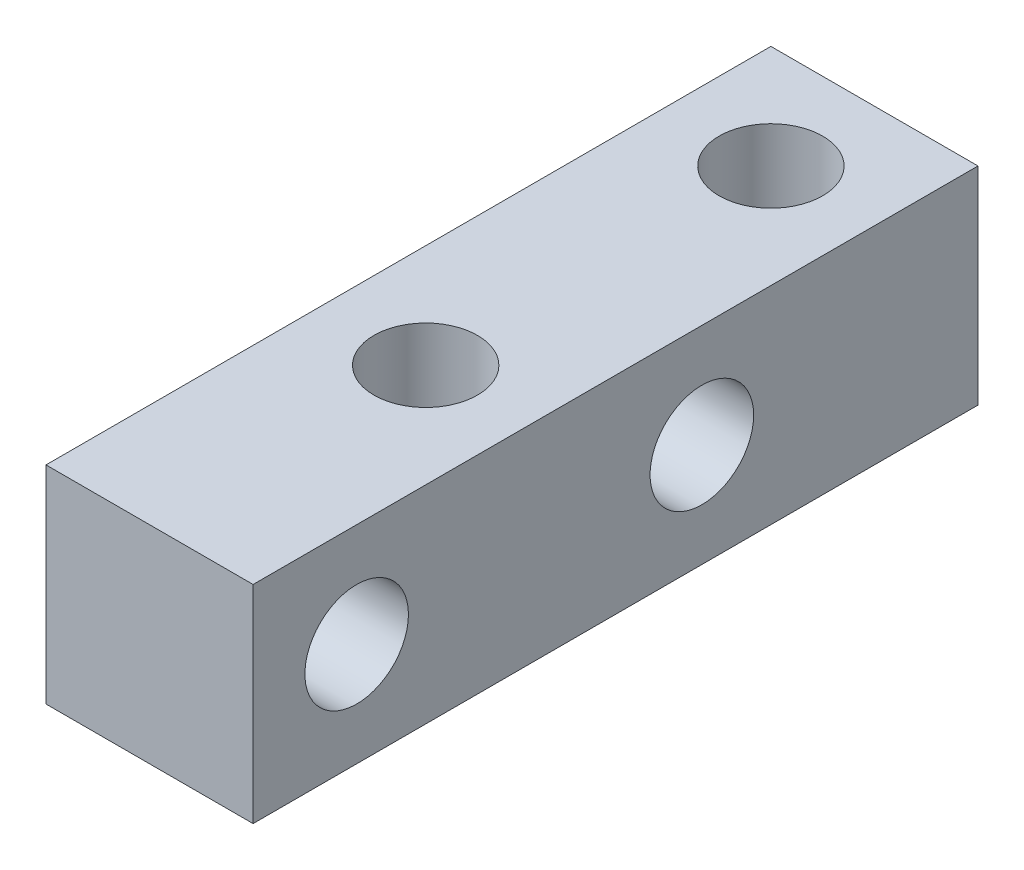
ISO-10303-21;
HEADER;
FILE_DESCRIPTION(('STEP AP214'),'2;1');
FILE_NAME('part.step','',(''),(''),'','','');
FILE_SCHEMA(('AUTOMOTIVE_DESIGN { 1 0 10303 214 1 1 1 1 }'));
ENDSEC;
DATA;
#1=APPLICATION_CONTEXT('core data for automotive mechanical design processes');
#2=APPLICATION_PROTOCOL_DEFINITION('international standard','automotive_design',2000,#1);
#3=PRODUCT_CONTEXT('',#1,'mechanical');
#4=PRODUCT('Part','Part','',(#3));
#5=PRODUCT_RELATED_PRODUCT_CATEGORY('part','',(#4));
#6=PRODUCT_DEFINITION_FORMATION('','',#4);
#7=PRODUCT_DEFINITION_CONTEXT('part definition',#1,'design');
#8=PRODUCT_DEFINITION('design','',#6,#7);
#9=PRODUCT_DEFINITION_SHAPE('','',#8);
#10=(LENGTH_UNIT() NAMED_UNIT(*) SI_UNIT(.MILLI.,.METRE.));
#11=(NAMED_UNIT(*) PLANE_ANGLE_UNIT() SI_UNIT($,.RADIAN.));
#12=(NAMED_UNIT(*) SI_UNIT($,.STERADIAN.) SOLID_ANGLE_UNIT());
#13=UNCERTAINTY_MEASURE_WITH_UNIT(LENGTH_MEASURE(1.E-05),#10,'distance_accuracy_value','');
#14=(GEOMETRIC_REPRESENTATION_CONTEXT(3) GLOBAL_UNCERTAINTY_ASSIGNED_CONTEXT((#13)) GLOBAL_UNIT_ASSIGNED_CONTEXT((#10,
#11,#12)) REPRESENTATION_CONTEXT('',''));
#15=CARTESIAN_POINT('',(0.,0.,0.));
#16=DIRECTION('',(0.,0.,1.));
#17=DIRECTION('',(1.,0.,0.));
#18=AXIS2_PLACEMENT_3D('',#15,#16,#17);
#19=CARTESIAN_POINT('',(3.,-3.,21.));
#20=DIRECTION('',(-1.,0.,0.));
#21=DIRECTION('',(0.,0.,1.));
#22=AXIS2_PLACEMENT_3D('',#19,#20,#21);
#23=PLANE('',#22);
#24=CARTESIAN_POINT('',(3.,0.,18.));
#25=DIRECTION('',(1.,0.,0.));
#26=DIRECTION('',(0.,0.,-1.));
#27=AXIS2_PLACEMENT_3D('',#24,#25,#26);
#28=CIRCLE('',#27,1.5);
#29=CARTESIAN_POINT('',(3.,0.,16.5));
#30=VERTEX_POINT('',#29);
#31=EDGE_CURVE('E158',#30,#30,#28,.T.);
#32=ORIENTED_EDGE('',*,*,#31,.F.);
#33=EDGE_LOOP('',(#32));
#34=FACE_BOUND('',#33,.T.);
#35=CARTESIAN_POINT('',(3.,0.,8.));
#36=DIRECTION('',(1.,0.,0.));
#37=DIRECTION('',(0.,0.,-1.));
#38=AXIS2_PLACEMENT_3D('',#35,#36,#37);
#39=CIRCLE('',#38,1.5);
#40=CARTESIAN_POINT('',(3.,0.,6.5));
#41=VERTEX_POINT('',#40);
#42=EDGE_CURVE('E152',#41,#41,#39,.T.);
#43=ORIENTED_EDGE('',*,*,#42,.F.);
#44=EDGE_LOOP('',(#43));
#45=FACE_BOUND('',#44,.T.);
#46=DIRECTION('',(0.,1.,0.));
#47=VECTOR('',#46,1.);
#48=CARTESIAN_POINT('',(3.,-3.,0.));
#49=LINE('',#48,#47);
#50=CARTESIAN_POINT('',(3.,-3.,0.));
#51=VERTEX_POINT('',#50);
#52=CARTESIAN_POINT('',(3.,3.,0.));
#53=VERTEX_POINT('',#52);
#54=EDGE_CURVE('E114',#51,#53,#49,.T.);
#55=ORIENTED_EDGE('',*,*,#54,.T.);
#56=DIRECTION('',(0.,0.,-1.));
#57=VECTOR('',#56,1.);
#58=CARTESIAN_POINT('',(3.,3.,21.));
#59=LINE('',#58,#57);
#60=CARTESIAN_POINT('',(3.,3.,21.));
#61=VERTEX_POINT('',#60);
#62=EDGE_CURVE('E11',#61,#53,#59,.T.);
#63=ORIENTED_EDGE('',*,*,#62,.F.);
#64=DIRECTION('',(0.,1.,0.));
#65=VECTOR('',#64,1.);
#66=CARTESIAN_POINT('',(3.,-3.,21.));
#67=LINE('',#66,#65);
#68=CARTESIAN_POINT('',(3.,-3.,21.));
#69=VERTEX_POINT('',#68);
#70=EDGE_CURVE('E100',#69,#61,#67,.T.);
#71=ORIENTED_EDGE('',*,*,#70,.F.);
#72=DIRECTION('',(0.,0.,-1.));
#73=VECTOR('',#72,1.);
#74=CARTESIAN_POINT('',(3.,-3.,21.));
#75=LINE('',#74,#73);
#76=EDGE_CURVE('E108',#69,#51,#75,.T.);
#77=ORIENTED_EDGE('',*,*,#76,.T.);
#78=EDGE_LOOP('',(#55,#63,#71,#77));
#79=FACE_BOUND('',#78,.T.);
#80=ADVANCED_FACE('F44',(#34,#45,#79),#23,.F.);
#81=CARTESIAN_POINT('',(-3.,3.,21.));
#82=DIRECTION('',(0.,-1.,0.));
#83=DIRECTION('',(0.,0.,-1.));
#84=AXIS2_PLACEMENT_3D('',#81,#82,#83);
#85=PLANE('',#84);
#86=CARTESIAN_POINT('',(0.,3.,3.));
#87=DIRECTION('',(0.,1.,0.));
#88=DIRECTION('',(0.,0.,1.));
#89=AXIS2_PLACEMENT_3D('',#86,#87,#88);
#90=CIRCLE('',#89,1.5);
#91=CARTESIAN_POINT('',(0.,3.,4.5));
#92=VERTEX_POINT('',#91);
#93=EDGE_CURVE('E141',#92,#92,#90,.T.);
#94=ORIENTED_EDGE('',*,*,#93,.F.);
#95=EDGE_LOOP('',(#94));
#96=FACE_BOUND('',#95,.T.);
#97=CARTESIAN_POINT('',(0.,3.,13.));
#98=DIRECTION('',(0.,1.,0.));
#99=DIRECTION('',(0.,0.,1.));
#100=AXIS2_PLACEMENT_3D('',#97,#98,#99);
#101=CIRCLE('',#100,1.5);
#102=CARTESIAN_POINT('',(0.,3.,14.5));
#103=VERTEX_POINT('',#102);
#104=EDGE_CURVE('E140',#103,#103,#101,.T.);
#105=ORIENTED_EDGE('',*,*,#104,.F.);
#106=EDGE_LOOP('',(#105));
#107=FACE_BOUND('',#106,.T.);
#108=DIRECTION('',(-1.,0.,0.));
#109=VECTOR('',#108,1.);
#110=CARTESIAN_POINT('',(-3.,3.,0.));
#111=LINE('',#110,#109);
#112=CARTESIAN_POINT('',(-3.,3.,0.));
#113=VERTEX_POINT('',#112);
#114=EDGE_CURVE('E105',#53,#113,#111,.T.);
#115=ORIENTED_EDGE('',*,*,#114,.T.);
#116=DIRECTION('',(0.,0.,-1.));
#117=VECTOR('',#116,1.);
#118=CARTESIAN_POINT('',(-3.,3.,21.));
#119=LINE('',#118,#117);
#120=CARTESIAN_POINT('',(-3.,3.,21.));
#121=VERTEX_POINT('',#120);
#122=EDGE_CURVE('E53',#121,#113,#119,.T.);
#123=ORIENTED_EDGE('',*,*,#122,.F.);
#124=DIRECTION('',(-1.,0.,0.));
#125=VECTOR('',#124,1.);
#126=CARTESIAN_POINT('',(-3.,3.,21.));
#127=LINE('',#126,#125);
#128=EDGE_CURVE('E95',#61,#121,#127,.T.);
#129=ORIENTED_EDGE('',*,*,#128,.F.);
#130=ORIENTED_EDGE('',*,*,#62,.T.);
#131=EDGE_LOOP('',(#115,#123,#129,#130));
#132=FACE_BOUND('',#131,.T.);
#133=ADVANCED_FACE('F101',(#96,#107,#132),#85,.F.);
#134=CARTESIAN_POINT('',(-3.,-3.,21.));
#135=DIRECTION('',(1.,0.,0.));
#136=DIRECTION('',(0.,0.,-1.));
#137=AXIS2_PLACEMENT_3D('',#134,#135,#136);
#138=PLANE('',#137);
#139=CARTESIAN_POINT('',(-3.,0.,18.));
#140=DIRECTION('',(1.,0.,0.));
#141=DIRECTION('',(0.,0.,-1.));
#142=AXIS2_PLACEMENT_3D('',#139,#140,#141);
#143=CIRCLE('',#142,1.5);
#144=CARTESIAN_POINT('',(-3.,0.,16.5));
#145=VERTEX_POINT('',#144);
#146=EDGE_CURVE('E138',#145,#145,#143,.T.);
#147=ORIENTED_EDGE('',*,*,#146,.T.);
#148=EDGE_LOOP('',(#147));
#149=FACE_BOUND('',#148,.T.);
#150=CARTESIAN_POINT('',(-3.,0.,8.));
#151=DIRECTION('',(1.,0.,0.));
#152=DIRECTION('',(0.,0.,-1.));
#153=AXIS2_PLACEMENT_3D('',#150,#151,#152);
#154=CIRCLE('',#153,1.5);
#155=CARTESIAN_POINT('',(-3.,0.,6.5));
#156=VERTEX_POINT('',#155);
#157=EDGE_CURVE('E147',#156,#156,#154,.T.);
#158=ORIENTED_EDGE('',*,*,#157,.T.);
#159=EDGE_LOOP('',(#158));
#160=FACE_BOUND('',#159,.T.);
#161=DIRECTION('',(0.,-1.,0.));
#162=VECTOR('',#161,1.);
#163=CARTESIAN_POINT('',(-3.,-3.,0.));
#164=LINE('',#163,#162);
#165=CARTESIAN_POINT('',(-3.,-3.,0.));
#166=VERTEX_POINT('',#165);
#167=EDGE_CURVE('E76',#113,#166,#164,.T.);
#168=ORIENTED_EDGE('',*,*,#167,.T.);
#169=DIRECTION('',(0.,0.,-1.));
#170=VECTOR('',#169,1.);
#171=CARTESIAN_POINT('',(-3.,-3.,21.));
#172=LINE('',#171,#170);
#173=CARTESIAN_POINT('',(-3.,-3.,21.));
#174=VERTEX_POINT('',#173);
#175=EDGE_CURVE('E102',#174,#166,#172,.T.);
#176=ORIENTED_EDGE('',*,*,#175,.F.);
#177=DIRECTION('',(0.,-1.,0.));
#178=VECTOR('',#177,1.);
#179=CARTESIAN_POINT('',(-3.,-3.,21.));
#180=LINE('',#179,#178);
#181=EDGE_CURVE('E92',#121,#174,#180,.T.);
#182=ORIENTED_EDGE('',*,*,#181,.F.);
#183=ORIENTED_EDGE('',*,*,#122,.T.);
#184=EDGE_LOOP('',(#168,#176,#182,#183));
#185=FACE_BOUND('',#184,.T.);
#186=ADVANCED_FACE('F104',(#149,#160,#185),#138,.F.);
#187=CARTESIAN_POINT('',(-3.,-3.,21.));
#188=DIRECTION('',(0.,1.,0.));
#189=DIRECTION('',(0.,0.,1.));
#190=AXIS2_PLACEMENT_3D('',#187,#188,#189);
#191=PLANE('',#190);
#192=CARTESIAN_POINT('',(0.,-3.,3.));
#193=DIRECTION('',(0.,1.,0.));
#194=DIRECTION('',(0.,0.,1.));
#195=AXIS2_PLACEMENT_3D('',#192,#193,#194);
#196=CIRCLE('',#195,1.5);
#197=CARTESIAN_POINT('',(0.,-3.,4.5));
#198=VERTEX_POINT('',#197);
#199=EDGE_CURVE('E120',#198,#198,#196,.T.);
#200=ORIENTED_EDGE('',*,*,#199,.T.);
#201=EDGE_LOOP('',(#200));
#202=FACE_BOUND('',#201,.T.);
#203=CARTESIAN_POINT('',(0.,-3.,13.));
#204=DIRECTION('',(0.,1.,0.));
#205=DIRECTION('',(0.,0.,1.));
#206=AXIS2_PLACEMENT_3D('',#203,#204,#205);
#207=CIRCLE('',#206,1.5);
#208=CARTESIAN_POINT('',(0.,-3.,14.5));
#209=VERTEX_POINT('',#208);
#210=EDGE_CURVE('E131',#209,#209,#207,.T.);
#211=ORIENTED_EDGE('',*,*,#210,.T.);
#212=EDGE_LOOP('',(#211));
#213=FACE_BOUND('',#212,.T.);
#214=DIRECTION('',(1.,0.,0.));
#215=VECTOR('',#214,1.);
#216=CARTESIAN_POINT('',(-3.,-3.,0.));
#217=LINE('',#216,#215);
#218=EDGE_CURVE('E82',#166,#51,#217,.T.);
#219=ORIENTED_EDGE('',*,*,#218,.T.);
#220=ORIENTED_EDGE('',*,*,#76,.F.);
#221=DIRECTION('',(1.,0.,0.));
#222=VECTOR('',#221,1.);
#223=CARTESIAN_POINT('',(-3.,-3.,21.));
#224=LINE('',#223,#222);
#225=EDGE_CURVE('E65',#174,#69,#224,.T.);
#226=ORIENTED_EDGE('',*,*,#225,.F.);
#227=ORIENTED_EDGE('',*,*,#175,.T.);
#228=EDGE_LOOP('',(#219,#220,#226,#227));
#229=FACE_BOUND('',#228,.T.);
#230=ADVANCED_FACE('F130',(#202,#213,#229),#191,.F.);
#231=CARTESIAN_POINT('',(0.,0.,21.));
#232=DIRECTION('',(0.,0.,-1.));
#233=DIRECTION('',(-1.,0.,0.));
#234=AXIS2_PLACEMENT_3D('',#231,#232,#233);
#235=PLANE('',#234);
#236=ORIENTED_EDGE('',*,*,#70,.T.);
#237=ORIENTED_EDGE('',*,*,#128,.T.);
#238=ORIENTED_EDGE('',*,*,#181,.T.);
#239=ORIENTED_EDGE('',*,*,#225,.T.);
#240=EDGE_LOOP('',(#236,#237,#238,#239));
#241=FACE_BOUND('',#240,.T.);
#242=ADVANCED_FACE('F91',(#241),#235,.F.);
#243=CARTESIAN_POINT('',(0.,0.,0.));
#244=DIRECTION('',(0.,0.,-1.));
#245=DIRECTION('',(-1.,0.,0.));
#246=AXIS2_PLACEMENT_3D('',#243,#244,#245);
#247=PLANE('',#246);
#248=ORIENTED_EDGE('',*,*,#54,.F.);
#249=ORIENTED_EDGE('',*,*,#218,.F.);
#250=ORIENTED_EDGE('',*,*,#167,.F.);
#251=ORIENTED_EDGE('',*,*,#114,.F.);
#252=EDGE_LOOP('',(#248,#249,#250,#251));
#253=FACE_BOUND('',#252,.T.);
#254=ADVANCED_FACE('F128',(#253),#247,.T.);
#255=CARTESIAN_POINT('',(0.,-3.,13.));
#256=DIRECTION('',(0.,1.,0.));
#257=DIRECTION('',(0.,0.,1.));
#258=AXIS2_PLACEMENT_3D('',#255,#256,#257);
#259=CYLINDRICAL_SURFACE('',#258,1.5);
#260=ORIENTED_EDGE('',*,*,#210,.F.);
#261=EDGE_LOOP('',(#260));
#262=FACE_BOUND('',#261,.T.);
#263=ORIENTED_EDGE('',*,*,#104,.T.);
#264=EDGE_LOOP('',(#263));
#265=FACE_BOUND('',#264,.T.);
#266=ADVANCED_FACE('F190',(#262,#265),#259,.F.);
#267=CARTESIAN_POINT('',(0.,-3.,3.));
#268=DIRECTION('',(0.,1.,0.));
#269=DIRECTION('',(0.,0.,1.));
#270=AXIS2_PLACEMENT_3D('',#267,#268,#269);
#271=CYLINDRICAL_SURFACE('',#270,1.5);
#272=ORIENTED_EDGE('',*,*,#199,.F.);
#273=EDGE_LOOP('',(#272));
#274=FACE_BOUND('',#273,.T.);
#275=ORIENTED_EDGE('',*,*,#93,.T.);
#276=EDGE_LOOP('',(#275));
#277=FACE_BOUND('',#276,.T.);
#278=ADVANCED_FACE('F177',(#274,#277),#271,.F.);
#279=CARTESIAN_POINT('',(-3.,0.,8.));
#280=DIRECTION('',(1.,0.,0.));
#281=DIRECTION('',(0.,0.,-1.));
#282=AXIS2_PLACEMENT_3D('',#279,#280,#281);
#283=CYLINDRICAL_SURFACE('',#282,1.5);
#284=ORIENTED_EDGE('',*,*,#157,.F.);
#285=EDGE_LOOP('',(#284));
#286=FACE_BOUND('',#285,.T.);
#287=ORIENTED_EDGE('',*,*,#42,.T.);
#288=EDGE_LOOP('',(#287));
#289=FACE_BOUND('',#288,.T.);
#290=ADVANCED_FACE('F172',(#286,#289),#283,.F.);
#291=CARTESIAN_POINT('',(-3.,0.,18.));
#292=DIRECTION('',(1.,0.,0.));
#293=DIRECTION('',(0.,0.,-1.));
#294=AXIS2_PLACEMENT_3D('',#291,#292,#293);
#295=CYLINDRICAL_SURFACE('',#294,1.5);
#296=ORIENTED_EDGE('',*,*,#146,.F.);
#297=EDGE_LOOP('',(#296));
#298=FACE_BOUND('',#297,.T.);
#299=ORIENTED_EDGE('',*,*,#31,.T.);
#300=EDGE_LOOP('',(#299));
#301=FACE_BOUND('',#300,.T.);
#302=ADVANCED_FACE('F169',(#298,#301),#295,.F.);
#303=CLOSED_SHELL('',(#80,#133,#186,#230,#242,#254,#266,#278,#290,#302));
#304=MANIFOLD_SOLID_BREP('B2',#303);
#305=ADVANCED_BREP_SHAPE_REPRESENTATION('',(#18,#304),#14);
#306=SHAPE_DEFINITION_REPRESENTATION(#9,#305);
ENDSEC;
END-ISO-10303-21;
